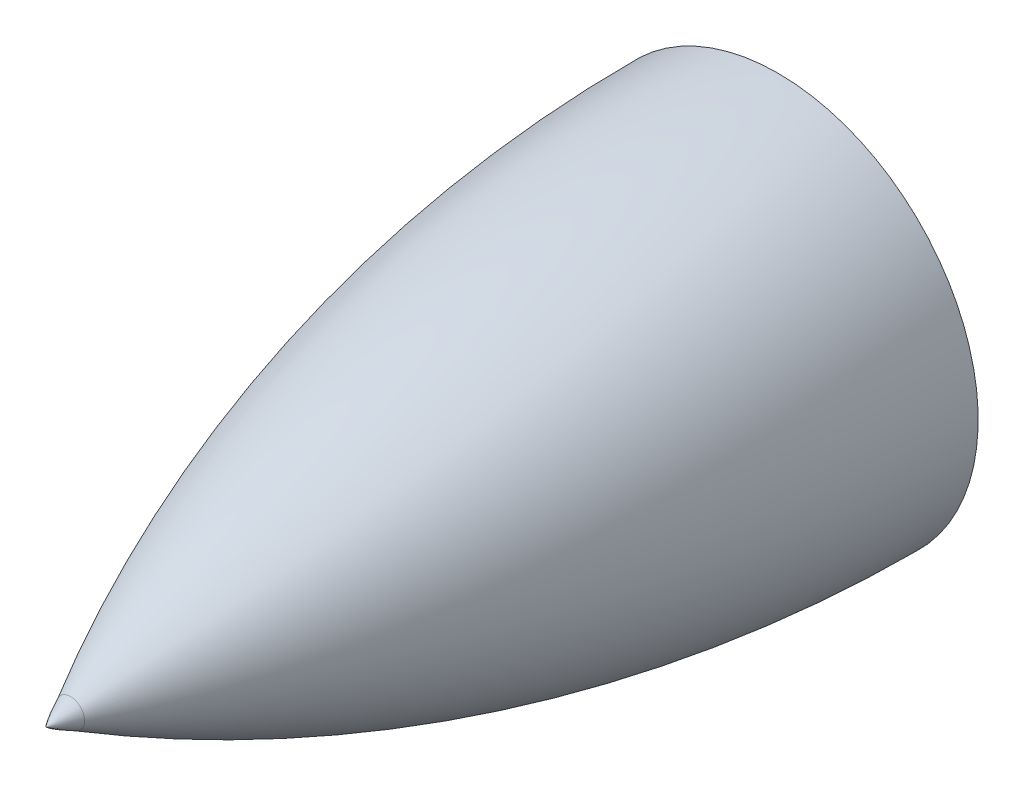
ISO-10303-21;
HEADER;
FILE_DESCRIPTION(('STEP AP214'),'2;1');
FILE_NAME('part.step','',(''),(''),'','','');
FILE_SCHEMA(('AUTOMOTIVE_DESIGN { 1 0 10303 214 1 1 1 1 }'));
ENDSEC;
DATA;
#1=APPLICATION_CONTEXT('core data for automotive mechanical design processes');
#2=APPLICATION_PROTOCOL_DEFINITION('international standard','automotive_design',2000,#1);
#3=PRODUCT_CONTEXT('',#1,'mechanical');
#4=PRODUCT('Part','Part','',(#3));
#5=PRODUCT_RELATED_PRODUCT_CATEGORY('part','',(#4));
#6=PRODUCT_DEFINITION_FORMATION('','',#4);
#7=PRODUCT_DEFINITION_CONTEXT('part definition',#1,'design');
#8=PRODUCT_DEFINITION('design','',#6,#7);
#9=PRODUCT_DEFINITION_SHAPE('','',#8);
#10=(LENGTH_UNIT() NAMED_UNIT(*) SI_UNIT(.MILLI.,.METRE.));
#11=(NAMED_UNIT(*) PLANE_ANGLE_UNIT() SI_UNIT($,.RADIAN.));
#12=(NAMED_UNIT(*) SI_UNIT($,.STERADIAN.) SOLID_ANGLE_UNIT());
#13=UNCERTAINTY_MEASURE_WITH_UNIT(LENGTH_MEASURE(1.E-05),#10,'distance_accuracy_value','');
#14=(GEOMETRIC_REPRESENTATION_CONTEXT(3) GLOBAL_UNCERTAINTY_ASSIGNED_CONTEXT((#13)) GLOBAL_UNIT_ASSIGNED_CONTEXT((#10,
#11,#12)) REPRESENTATION_CONTEXT('',''));
#15=CARTESIAN_POINT('',(0.,0.,0.));
#16=DIRECTION('',(0.,0.,1.));
#17=DIRECTION('',(1.,0.,0.));
#18=AXIS2_PLACEMENT_3D('',#15,#16,#17);
#19=CARTESIAN_POINT('',(0.,253.890243902438,1.87916529672122E-13));
#20=DIRECTION('',(0.,0.,-1.));
#21=DIRECTION('',(0.,1.,0.));
#22=AXIS2_PLACEMENT_3D('',#19,#20,#21);
#23=DEGENERATE_TOROIDAL_SURFACE('',#22,253.890243902438,294.890243902438,.F.);
#24=CARTESIAN_POINT('',(0.,253.890243902438,0.));
#25=DIRECTION('',(0.,0.,-1.));
#26=DIRECTION('',(0.,1.,0.));
#27=AXIS2_PLACEMENT_3D('',#24,#25,#26);
#28=CIRCLE('',#27,41.);
#29=CARTESIAN_POINT('',(0.,294.890243902438,0.));
#30=VERTEX_POINT('',#29);
#31=EDGE_CURVE('E61',#30,#30,#28,.T.);
#32=ORIENTED_EDGE('',*,*,#31,.F.);
#33=EDGE_LOOP('',(#32));
#34=FACE_BOUND('',#33,.T.);
#35=CARTESIAN_POINT('',(0.,253.890243902438,145.));
#36=DIRECTION('',(0.,0.,1.));
#37=DIRECTION('',(0.,-1.,0.));
#38=AXIS2_PLACEMENT_3D('',#35,#36,#37);
#39=CIRCLE('',#38,2.88836881450832);
#40=CARTESIAN_POINT('',(0.,251.00187508793,145.));
#41=VERTEX_POINT('',#40);
#42=EDGE_CURVE('E59',#41,#41,#39,.T.);
#43=ORIENTED_EDGE('',*,*,#42,.F.);
#44=EDGE_LOOP('',(#43));
#45=FACE_BOUND('',#44,.T.);
#46=ADVANCED_FACE('F39',(#34,#45),#23,.F.);
#47=CARTESIAN_POINT('',(0.,0.,0.));
#48=DIRECTION('',(-1.,0.,0.));
#49=DIRECTION('',(0.,1.,0.));
#50=AXIS2_PLACEMENT_3D('',#47,#48,#49);
#51=CIRCLE('',#50,291.890243902438);
#52=TRIMMED_CURVE('',#51,(PARAMETER_VALUE(-0.515970961412169)),
(PARAMETER_VALUE(0.515970961412169)),.T.,.PARAMETER.);
#53=CARTESIAN_POINT('',(0.,253.890243902438,1.87916529672122E-13));
#54=DIRECTION('',(0.,0.,-1.));
#55=AXIS1_PLACEMENT('',#53,#54);
#56=SURFACE_OF_REVOLUTION('',#52,#55);
#57=CARTESIAN_POINT('',(0.,253.890243902438,34.));
#58=DIRECTION('',(0.,0.,-1.));
#59=DIRECTION('',(0.,1.,0.));
#60=AXIS2_PLACEMENT_3D('',#57,#58,#59);
#61=CIRCLE('',#60,36.0130408071782);
#62=CARTESIAN_POINT('',(0.,289.903284709616,34.));
#63=VERTEX_POINT('',#62);
#64=EDGE_CURVE('E11',#63,#63,#61,.T.);
#65=ORIENTED_EDGE('',*,*,#64,.T.);
#66=EDGE_LOOP('',(#65));
#67=FACE_BOUND('',#66,.T.);
#68=CARTESIAN_POINT('',(0.,253.890243902438,144.01270269176));
#69=VERTEX_POINT('',#68);
#70=VERTEX_LOOP('',#69);
#71=FACE_BOUND('',#70,.T.);
#72=ADVANCED_FACE('F88',(#67,#71),#56,.F.);
#73=CARTESIAN_POINT('',(0.,289.903284709616,33.9999999999998));
#74=DIRECTION('',(0.,0.,-1.));
#75=DIRECTION('',(0.,1.,0.));
#76=AXIS2_PLACEMENT_3D('',#73,#74,#75);
#77=PLANE('',#76);
#78=CARTESIAN_POINT('',(0.,253.890243902438,33.9999999999996));
#79=DIRECTION('',(0.,0.,-1.));
#80=DIRECTION('',(0.,1.,0.));
#81=AXIS2_PLACEMENT_3D('',#78,#79,#80);
#82=CIRCLE('',#81,37.5232685109815);
#83=CARTESIAN_POINT('',(0.,291.41351241342,33.9999999999997));
#84=VERTEX_POINT('',#83);
#85=EDGE_CURVE('E46',#84,#84,#82,.T.);
#86=ORIENTED_EDGE('',*,*,#85,.T.);
#87=EDGE_LOOP('',(#86));
#88=FACE_BOUND('',#87,.T.);
#89=ORIENTED_EDGE('',*,*,#64,.F.);
#90=EDGE_LOOP('',(#89));
#91=FACE_BOUND('',#90,.T.);
#92=ADVANCED_FACE('F75',(#88,#91),#77,.T.);
#93=CARTESIAN_POINT('',(0.,253.890243902438,1.87916529672122E-13));
#94=DIRECTION('',(0.,0.,-1.));
#95=DIRECTION('',(0.,1.,0.));
#96=AXIS2_PLACEMENT_3D('',#93,#94,#95);
#97=DEGENERATE_TOROIDAL_SURFACE('',#96,253.890243902438,293.390243902428,.F.);
#98=CARTESIAN_POINT('',(0.,253.890243902438,0.));
#99=DIRECTION('',(0.,0.,-1.));
#100=DIRECTION('',(0.,1.,0.));
#101=AXIS2_PLACEMENT_3D('',#98,#99,#100);
#102=CIRCLE('',#101,39.499999999987);
#103=CARTESIAN_POINT('',(0.,293.390243902425,0.));
#104=VERTEX_POINT('',#103);
#105=EDGE_CURVE('E64',#104,#104,#102,.T.);
#106=ORIENTED_EDGE('',*,*,#105,.T.);
#107=EDGE_LOOP('',(#106));
#108=FACE_BOUND('',#107,.T.);
#109=ORIENTED_EDGE('',*,*,#85,.F.);
#110=EDGE_LOOP('',(#109));
#111=FACE_BOUND('',#110,.T.);
#112=ADVANCED_FACE('F78',(#108,#111),#97,.T.);
#113=CARTESIAN_POINT('',(0.,293.390243902425,0.));
#114=DIRECTION('',(0.,0.,-1.));
#115=DIRECTION('',(0.,1.,0.));
#116=AXIS2_PLACEMENT_3D('',#113,#114,#115);
#117=PLANE('',#116);
#118=ORIENTED_EDGE('',*,*,#31,.T.);
#119=EDGE_LOOP('',(#118));
#120=FACE_BOUND('',#119,.T.);
#121=ORIENTED_EDGE('',*,*,#105,.F.);
#122=EDGE_LOOP('',(#121));
#123=FACE_BOUND('',#122,.T.);
#124=ADVANCED_FACE('F55',(#120,#123),#117,.T.);
#125=CARTESIAN_POINT('',(0.,256.778612716946,145.));
#126=CARTESIAN_POINT('',(0.,255.186690619915,148.366651087248));
#127=CARTESIAN_POINT('',(0.,254.065514024514,150.000000000015));
#128=CARTESIAN_POINT('',(0.,253.890243902438,150.));
#129=B_SPLINE_CURVE_WITH_KNOTS('',3,(#125,#126,#127,#128),.UNSPECIFIED.,.F.,.F.,(4,4),(0.,
0.500000000012152),.UNSPECIFIED.);
#130=CARTESIAN_POINT('',(0.,253.890243902438,145.));
#131=DIRECTION('',(0.,0.,-1.));
#132=AXIS1_PLACEMENT('',#130,#131);
#133=SURFACE_OF_REVOLUTION('',#129,#132);
#134=CARTESIAN_POINT('',(0.,253.890243902438,150.));
#135=VERTEX_POINT('',#134);
#136=VERTEX_LOOP('',#135);
#137=FACE_BOUND('',#136,.T.);
#138=ORIENTED_EDGE('',*,*,#42,.T.);
#139=EDGE_LOOP('',(#138));
#140=FACE_BOUND('',#139,.T.);
#141=ADVANCED_FACE('F52',(#137,#140),#133,.F.);
#142=CLOSED_SHELL('',(#46,#72,#92,#112,#124,#141));
#143=MANIFOLD_SOLID_BREP('B2',#142);
#144=ADVANCED_BREP_SHAPE_REPRESENTATION('',(#18,#143),#14);
#145=SHAPE_DEFINITION_REPRESENTATION(#9,#144);
ENDSEC;
END-ISO-10303-21;
